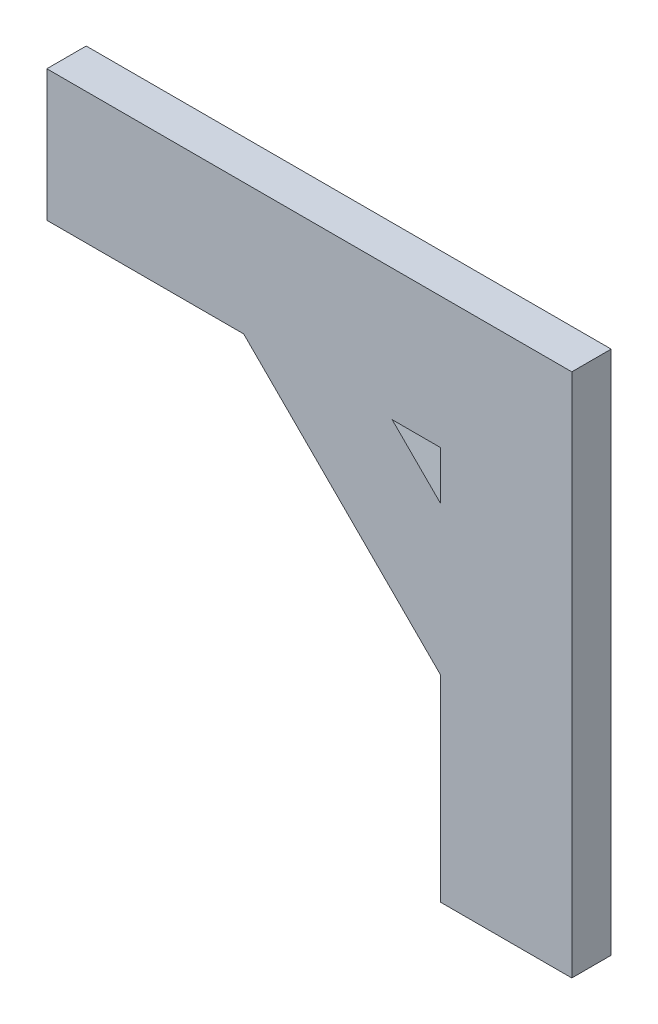
ISO-10303-21;
HEADER;
FILE_DESCRIPTION(('STEP AP214'),'2;1');
FILE_NAME('part.step','',(''),(''),'','','');
FILE_SCHEMA(('AUTOMOTIVE_DESIGN { 1 0 10303 214 1 1 1 1 }'));
ENDSEC;
DATA;
#1=APPLICATION_CONTEXT('core data for automotive mechanical design processes');
#2=APPLICATION_PROTOCOL_DEFINITION('international standard','automotive_design',2000,#1);
#3=PRODUCT_CONTEXT('',#1,'mechanical');
#4=PRODUCT('Part','Part','',(#3));
#5=PRODUCT_RELATED_PRODUCT_CATEGORY('part','',(#4));
#6=PRODUCT_DEFINITION_FORMATION('','',#4);
#7=PRODUCT_DEFINITION_CONTEXT('part definition',#1,'design');
#8=PRODUCT_DEFINITION('design','',#6,#7);
#9=PRODUCT_DEFINITION_SHAPE('','',#8);
#10=(LENGTH_UNIT() NAMED_UNIT(*) SI_UNIT(.MILLI.,.METRE.));
#11=(NAMED_UNIT(*) PLANE_ANGLE_UNIT() SI_UNIT($,.RADIAN.));
#12=(NAMED_UNIT(*) SI_UNIT($,.STERADIAN.) SOLID_ANGLE_UNIT());
#13=UNCERTAINTY_MEASURE_WITH_UNIT(LENGTH_MEASURE(1.E-05),#10,'distance_accuracy_value','');
#14=(GEOMETRIC_REPRESENTATION_CONTEXT(3) GLOBAL_UNCERTAINTY_ASSIGNED_CONTEXT((#13)) GLOBAL_UNIT_ASSIGNED_CONTEXT((#10,
#11,#12)) REPRESENTATION_CONTEXT('',''));
#15=CARTESIAN_POINT('',(0.,0.,0.));
#16=DIRECTION('',(0.,0.,1.));
#17=DIRECTION('',(1.,0.,0.));
#18=AXIS2_PLACEMENT_3D('',#15,#16,#17);
#19=CARTESIAN_POINT('',(0.,-10.,3.));
#20=DIRECTION('',(0.,1.,0.));
#21=DIRECTION('',(0.,0.,1.));
#22=AXIS2_PLACEMENT_3D('',#19,#20,#21);
#23=PLANE('',#22);
#24=DIRECTION('',(1.,0.,0.));
#25=VECTOR('',#24,1.);
#26=CARTESIAN_POINT('',(0.,-10.,0.));
#27=LINE('',#26,#25);
#28=CARTESIAN_POINT('',(0.,-10.,0.));
#29=VERTEX_POINT('',#28);
#30=CARTESIAN_POINT('',(15.,-10.,0.));
#31=VERTEX_POINT('',#30);
#32=EDGE_CURVE('E151',#29,#31,#27,.T.);
#33=ORIENTED_EDGE('',*,*,#32,.T.);
#34=DIRECTION('',(0.,0.,-1.));
#35=VECTOR('',#34,1.);
#36=CARTESIAN_POINT('',(15.,-10.,3.));
#37=LINE('',#36,#35);
#38=CARTESIAN_POINT('',(15.,-10.,3.));
#39=VERTEX_POINT('',#38);
#40=EDGE_CURVE('E11',#39,#31,#37,.T.);
#41=ORIENTED_EDGE('',*,*,#40,.F.);
#42=DIRECTION('',(1.,0.,0.));
#43=VECTOR('',#42,1.);
#44=CARTESIAN_POINT('',(0.,-10.,3.));
#45=LINE('',#44,#43);
#46=CARTESIAN_POINT('',(0.,-10.,3.));
#47=VERTEX_POINT('',#46);
#48=EDGE_CURVE('E220',#47,#39,#45,.T.);
#49=ORIENTED_EDGE('',*,*,#48,.F.);
#50=DIRECTION('',(0.,0.,-1.));
#51=VECTOR('',#50,1.);
#52=CARTESIAN_POINT('',(0.,-10.,3.));
#53=LINE('',#52,#51);
#54=EDGE_CURVE('E165',#47,#29,#53,.T.);
#55=ORIENTED_EDGE('',*,*,#54,.T.);
#56=EDGE_LOOP('',(#33,#41,#49,#55));
#57=FACE_BOUND('',#56,.T.);
#58=ADVANCED_FACE('F35',(#57),#23,.F.);
#59=CARTESIAN_POINT('',(2.5,2.5,3.));
#60=DIRECTION('',(0.707106781186547,0.707106781186547,0.));
#61=DIRECTION('',(-0.707106781186548,0.707106781186548,0.));
#62=AXIS2_PLACEMENT_3D('',#59,#60,#61);
#63=PLANE('',#62);
#64=DIRECTION('',(0.707106781186548,-0.707106781186548,0.));
#65=VECTOR('',#64,1.);
#66=CARTESIAN_POINT('',(2.5,2.5,0.));
#67=LINE('',#66,#65);
#68=CARTESIAN_POINT('',(30.,-25.,0.));
#69=VERTEX_POINT('',#68);
#70=EDGE_CURVE('E155',#31,#69,#67,.T.);
#71=ORIENTED_EDGE('',*,*,#70,.T.);
#72=DIRECTION('',(0.,0.,-1.));
#73=VECTOR('',#72,1.);
#74=CARTESIAN_POINT('',(30.,-25.,3.));
#75=LINE('',#74,#73);
#76=CARTESIAN_POINT('',(30.,-25.,3.));
#77=VERTEX_POINT('',#76);
#78=EDGE_CURVE('E45',#77,#69,#75,.T.);
#79=ORIENTED_EDGE('',*,*,#78,.F.);
#80=DIRECTION('',(0.707106781186548,-0.707106781186548,0.));
#81=VECTOR('',#80,1.);
#82=CARTESIAN_POINT('',(2.5,2.5,3.));
#83=LINE('',#82,#81);
#84=EDGE_CURVE('E217',#39,#77,#83,.T.);
#85=ORIENTED_EDGE('',*,*,#84,.F.);
#86=ORIENTED_EDGE('',*,*,#40,.T.);
#87=EDGE_LOOP('',(#71,#79,#85,#86));
#88=FACE_BOUND('',#87,.T.);
#89=ADVANCED_FACE('F202',(#88),#63,.F.);
#90=CARTESIAN_POINT('',(30.,0.,3.));
#91=DIRECTION('',(1.,0.,0.));
#92=DIRECTION('',(0.,1.,0.));
#93=AXIS2_PLACEMENT_3D('',#90,#91,#92);
#94=PLANE('',#93);
#95=DIRECTION('',(0.,-1.,0.));
#96=VECTOR('',#95,1.);
#97=CARTESIAN_POINT('',(30.,0.,0.));
#98=LINE('',#97,#96);
#99=CARTESIAN_POINT('',(30.,-40.,0.));
#100=VERTEX_POINT('',#99);
#101=EDGE_CURVE('E154',#69,#100,#98,.T.);
#102=ORIENTED_EDGE('',*,*,#101,.T.);
#103=DIRECTION('',(0.,0.,-1.));
#104=VECTOR('',#103,1.);
#105=CARTESIAN_POINT('',(30.,-40.,3.));
#106=LINE('',#105,#104);
#107=CARTESIAN_POINT('',(30.,-40.,3.));
#108=VERTEX_POINT('',#107);
#109=EDGE_CURVE('E169',#108,#100,#106,.T.);
#110=ORIENTED_EDGE('',*,*,#109,.F.);
#111=DIRECTION('',(0.,-1.,0.));
#112=VECTOR('',#111,1.);
#113=CARTESIAN_POINT('',(30.,0.,3.));
#114=LINE('',#113,#112);
#115=EDGE_CURVE('E219',#77,#108,#114,.T.);
#116=ORIENTED_EDGE('',*,*,#115,.F.);
#117=ORIENTED_EDGE('',*,*,#78,.T.);
#118=EDGE_LOOP('',(#102,#110,#116,#117));
#119=FACE_BOUND('',#118,.T.);
#120=ADVANCED_FACE('F192',(#119),#94,.F.);
#121=CARTESIAN_POINT('',(0.,-40.,3.));
#122=DIRECTION('',(0.,-1.,0.));
#123=DIRECTION('',(0.,0.,-1.));
#124=AXIS2_PLACEMENT_3D('',#121,#122,#123);
#125=PLANE('',#124);
#126=DIRECTION('',(-1.,0.,0.));
#127=VECTOR('',#126,1.);
#128=CARTESIAN_POINT('',(0.,-40.,0.));
#129=LINE('',#128,#127);
#130=CARTESIAN_POINT('',(40.,-40.,0.));
#131=VERTEX_POINT('',#130);
#132=EDGE_CURVE('E157',#131,#100,#129,.T.);
#133=ORIENTED_EDGE('',*,*,#132,.F.);
#134=DIRECTION('',(0.,0.,-1.));
#135=VECTOR('',#134,1.);
#136=CARTESIAN_POINT('',(40.,-40.,3.));
#137=LINE('',#136,#135);
#138=CARTESIAN_POINT('',(40.,-40.,3.));
#139=VERTEX_POINT('',#138);
#140=EDGE_CURVE('E131',#139,#131,#137,.T.);
#141=ORIENTED_EDGE('',*,*,#140,.F.);
#142=DIRECTION('',(-1.,0.,0.));
#143=VECTOR('',#142,1.);
#144=CARTESIAN_POINT('',(0.,-40.,3.));
#145=LINE('',#144,#143);
#146=EDGE_CURVE('E137',#139,#108,#145,.T.);
#147=ORIENTED_EDGE('',*,*,#146,.T.);
#148=ORIENTED_EDGE('',*,*,#109,.T.);
#149=EDGE_LOOP('',(#133,#141,#147,#148));
#150=FACE_BOUND('',#149,.T.);
#151=ADVANCED_FACE('F201',(#150),#125,.T.);
#152=CARTESIAN_POINT('',(40.,0.,3.));
#153=DIRECTION('',(1.,0.,0.));
#154=DIRECTION('',(0.,1.,0.));
#155=AXIS2_PLACEMENT_3D('',#152,#153,#154);
#156=PLANE('',#155);
#157=DIRECTION('',(0.,-1.,0.));
#158=VECTOR('',#157,1.);
#159=CARTESIAN_POINT('',(40.,0.,0.));
#160=LINE('',#159,#158);
#161=CARTESIAN_POINT('',(40.,0.,0.));
#162=VERTEX_POINT('',#161);
#163=EDGE_CURVE('E126',#162,#131,#160,.T.);
#164=ORIENTED_EDGE('',*,*,#163,.F.);
#165=DIRECTION('',(0.,0.,-1.));
#166=VECTOR('',#165,1.);
#167=CARTESIAN_POINT('',(40.,0.,3.));
#168=LINE('',#167,#166);
#169=CARTESIAN_POINT('',(40.,0.,3.));
#170=VERTEX_POINT('',#169);
#171=EDGE_CURVE('E121',#170,#162,#168,.T.);
#172=ORIENTED_EDGE('',*,*,#171,.F.);
#173=DIRECTION('',(0.,-1.,0.));
#174=VECTOR('',#173,1.);
#175=CARTESIAN_POINT('',(40.,0.,3.));
#176=LINE('',#175,#174);
#177=EDGE_CURVE('E124',#170,#139,#176,.T.);
#178=ORIENTED_EDGE('',*,*,#177,.T.);
#179=ORIENTED_EDGE('',*,*,#140,.T.);
#180=EDGE_LOOP('',(#164,#172,#178,#179));
#181=FACE_BOUND('',#180,.T.);
#182=ADVANCED_FACE('F123',(#181),#156,.T.);
#183=CARTESIAN_POINT('',(0.,0.,3.));
#184=DIRECTION('',(0.,1.,0.));
#185=DIRECTION('',(0.,0.,1.));
#186=AXIS2_PLACEMENT_3D('',#183,#184,#185);
#187=PLANE('',#186);
#188=DIRECTION('',(1.,0.,0.));
#189=VECTOR('',#188,1.);
#190=CARTESIAN_POINT('',(0.,0.,0.));
#191=LINE('',#190,#189);
#192=CARTESIAN_POINT('',(0.,0.,0.));
#193=VERTEX_POINT('',#192);
#194=EDGE_CURVE('E161',#193,#162,#191,.T.);
#195=ORIENTED_EDGE('',*,*,#194,.F.);
#196=DIRECTION('',(0.,0.,-1.));
#197=VECTOR('',#196,1.);
#198=CARTESIAN_POINT('',(0.,0.,3.));
#199=LINE('',#198,#197);
#200=CARTESIAN_POINT('',(0.,0.,3.));
#201=VERTEX_POINT('',#200);
#202=EDGE_CURVE('E88',#201,#193,#199,.T.);
#203=ORIENTED_EDGE('',*,*,#202,.F.);
#204=DIRECTION('',(1.,0.,0.));
#205=VECTOR('',#204,1.);
#206=CARTESIAN_POINT('',(0.,0.,3.));
#207=LINE('',#206,#205);
#208=EDGE_CURVE('E135',#201,#170,#207,.T.);
#209=ORIENTED_EDGE('',*,*,#208,.T.);
#210=ORIENTED_EDGE('',*,*,#171,.T.);
#211=EDGE_LOOP('',(#195,#203,#209,#210));
#212=FACE_BOUND('',#211,.T.);
#213=ADVANCED_FACE('F139',(#212),#187,.T.);
#214=CARTESIAN_POINT('',(8.15685424949239,8.15685424949239,3.));
#215=DIRECTION('',(0.707106781186548,0.707106781186547,0.));
#216=DIRECTION('',(-0.707106781186547,0.707106781186548,0.));
#217=AXIS2_PLACEMENT_3D('',#214,#215,#216);
#218=PLANE('',#217);
#219=DIRECTION('',(0.707106781186547,-0.707106781186548,0.));
#220=VECTOR('',#219,1.);
#221=CARTESIAN_POINT('',(8.15685424949239,8.15685424949239,0.));
#222=LINE('',#221,#220);
#223=CARTESIAN_POINT('',(26.3137084989848,-10.,0.));
#224=VERTEX_POINT('',#223);
#225=CARTESIAN_POINT('',(30.,-13.6862915010152,0.));
#226=VERTEX_POINT('',#225);
#227=EDGE_CURVE('E145',#224,#226,#222,.T.);
#228=ORIENTED_EDGE('',*,*,#227,.F.);
#229=DIRECTION('',(0.,0.,-1.));
#230=VECTOR('',#229,1.);
#231=CARTESIAN_POINT('',(26.3137084989848,-10.,3.));
#232=LINE('',#231,#230);
#233=CARTESIAN_POINT('',(26.3137084989848,-10.,3.));
#234=VERTEX_POINT('',#233);
#235=EDGE_CURVE('E39',#234,#224,#232,.T.);
#236=ORIENTED_EDGE('',*,*,#235,.F.);
#237=DIRECTION('',(0.707106781186547,-0.707106781186548,0.));
#238=VECTOR('',#237,1.);
#239=CARTESIAN_POINT('',(8.15685424949239,8.15685424949239,3.));
#240=LINE('',#239,#238);
#241=CARTESIAN_POINT('',(30.,-13.6862915010152,3.));
#242=VERTEX_POINT('',#241);
#243=EDGE_CURVE('E164',#234,#242,#240,.T.);
#244=ORIENTED_EDGE('',*,*,#243,.T.);
#245=DIRECTION('',(0.,0.,-1.));
#246=VECTOR('',#245,1.);
#247=CARTESIAN_POINT('',(30.,-13.6862915010152,3.));
#248=LINE('',#247,#246);
#249=EDGE_CURVE('E141',#242,#226,#248,.T.);
#250=ORIENTED_EDGE('',*,*,#249,.T.);
#251=EDGE_LOOP('',(#228,#236,#244,#250));
#252=FACE_BOUND('',#251,.T.);
#253=ADVANCED_FACE('F37',(#252),#218,.T.);
#254=CARTESIAN_POINT('',(30.,-10.,0.));
#255=VERTEX_POINT('',#254);
#256=EDGE_CURVE('E148',#224,#255,#27,.T.);
#257=ORIENTED_EDGE('',*,*,#256,.T.);
#258=DIRECTION('',(0.,0.,-1.));
#259=VECTOR('',#258,1.);
#260=CARTESIAN_POINT('',(30.,-10.,3.));
#261=LINE('',#260,#259);
#262=CARTESIAN_POINT('',(30.,-10.,3.));
#263=VERTEX_POINT('',#262);
#264=EDGE_CURVE('E173',#263,#255,#261,.T.);
#265=ORIENTED_EDGE('',*,*,#264,.F.);
#266=EDGE_CURVE('E182',#234,#263,#45,.T.);
#267=ORIENTED_EDGE('',*,*,#266,.F.);
#268=ORIENTED_EDGE('',*,*,#235,.T.);
#269=EDGE_LOOP('',(#257,#265,#267,#268));
#270=FACE_BOUND('',#269,.T.);
#271=ADVANCED_FACE('F181',(#270),#23,.F.);
#272=EDGE_CURVE('E150',#255,#226,#98,.T.);
#273=ORIENTED_EDGE('',*,*,#272,.T.);
#274=ORIENTED_EDGE('',*,*,#249,.F.);
#275=EDGE_CURVE('E222',#263,#242,#114,.T.);
#276=ORIENTED_EDGE('',*,*,#275,.F.);
#277=ORIENTED_EDGE('',*,*,#264,.T.);
#278=EDGE_LOOP('',(#273,#274,#276,#277));
#279=FACE_BOUND('',#278,.T.);
#280=ADVANCED_FACE('F188',(#279),#94,.F.);
#281=CARTESIAN_POINT('',(0.,0.,3.));
#282=DIRECTION('',(1.,0.,0.));
#283=DIRECTION('',(0.,0.,-1.));
#284=AXIS2_PLACEMENT_3D('',#281,#282,#283);
#285=PLANE('',#284);
#286=DIRECTION('',(0.,-1.,0.));
#287=VECTOR('',#286,1.);
#288=CARTESIAN_POINT('',(0.,0.,0.));
#289=LINE('',#288,#287);
#290=EDGE_CURVE('E91',#193,#29,#289,.T.);
#291=ORIENTED_EDGE('',*,*,#290,.T.);
#292=ORIENTED_EDGE('',*,*,#54,.F.);
#293=DIRECTION('',(0.,-1.,0.));
#294=VECTOR('',#293,1.);
#295=CARTESIAN_POINT('',(0.,0.,3.));
#296=LINE('',#295,#294);
#297=EDGE_CURVE('E54',#201,#47,#296,.T.);
#298=ORIENTED_EDGE('',*,*,#297,.F.);
#299=ORIENTED_EDGE('',*,*,#202,.T.);
#300=EDGE_LOOP('',(#291,#292,#298,#299));
#301=FACE_BOUND('',#300,.T.);
#302=ADVANCED_FACE('F190',(#301),#285,.F.);
#303=CARTESIAN_POINT('',(0.,0.,3.));
#304=DIRECTION('',(0.,0.,1.));
#305=DIRECTION('',(1.,0.,0.));
#306=AXIS2_PLACEMENT_3D('',#303,#304,#305);
#307=PLANE('',#306);
#308=ORIENTED_EDGE('',*,*,#243,.F.);
#309=ORIENTED_EDGE('',*,*,#266,.T.);
#310=ORIENTED_EDGE('',*,*,#275,.T.);
#311=EDGE_LOOP('',(#308,#309,#310));
#312=FACE_BOUND('',#311,.T.);
#313=ORIENTED_EDGE('',*,*,#48,.T.);
#314=ORIENTED_EDGE('',*,*,#84,.T.);
#315=ORIENTED_EDGE('',*,*,#115,.T.);
#316=ORIENTED_EDGE('',*,*,#146,.F.);
#317=ORIENTED_EDGE('',*,*,#177,.F.);
#318=ORIENTED_EDGE('',*,*,#208,.F.);
#319=ORIENTED_EDGE('',*,*,#297,.T.);
#320=EDGE_LOOP('',(#313,#314,#315,#316,#317,#318,#319));
#321=FACE_BOUND('',#320,.T.);
#322=ADVANCED_FACE('F134',(#312,#321),#307,.T.);
#323=CARTESIAN_POINT('',(0.,0.,0.));
#324=DIRECTION('',(0.,0.,1.));
#325=DIRECTION('',(1.,0.,0.));
#326=AXIS2_PLACEMENT_3D('',#323,#324,#325);
#327=PLANE('',#326);
#328=ORIENTED_EDGE('',*,*,#227,.T.);
#329=ORIENTED_EDGE('',*,*,#272,.F.);
#330=ORIENTED_EDGE('',*,*,#256,.F.);
#331=EDGE_LOOP('',(#328,#329,#330));
#332=FACE_BOUND('',#331,.T.);
#333=ORIENTED_EDGE('',*,*,#32,.F.);
#334=ORIENTED_EDGE('',*,*,#290,.F.);
#335=ORIENTED_EDGE('',*,*,#194,.T.);
#336=ORIENTED_EDGE('',*,*,#163,.T.);
#337=ORIENTED_EDGE('',*,*,#132,.T.);
#338=ORIENTED_EDGE('',*,*,#101,.F.);
#339=ORIENTED_EDGE('',*,*,#70,.F.);
#340=EDGE_LOOP('',(#333,#334,#335,#336,#337,#338,#339));
#341=FACE_BOUND('',#340,.T.);
#342=ADVANCED_FACE('F185',(#332,#341),#327,.F.);
#343=CLOSED_SHELL('',(#58,#89,#120,#151,#182,#213,#253,#271,#280,#302,#322,#342));
#344=MANIFOLD_SOLID_BREP('B2',#343);
#345=ADVANCED_BREP_SHAPE_REPRESENTATION('',(#18,#344),#14);
#346=SHAPE_DEFINITION_REPRESENTATION(#9,#345);
ENDSEC;
END-ISO-10303-21;
